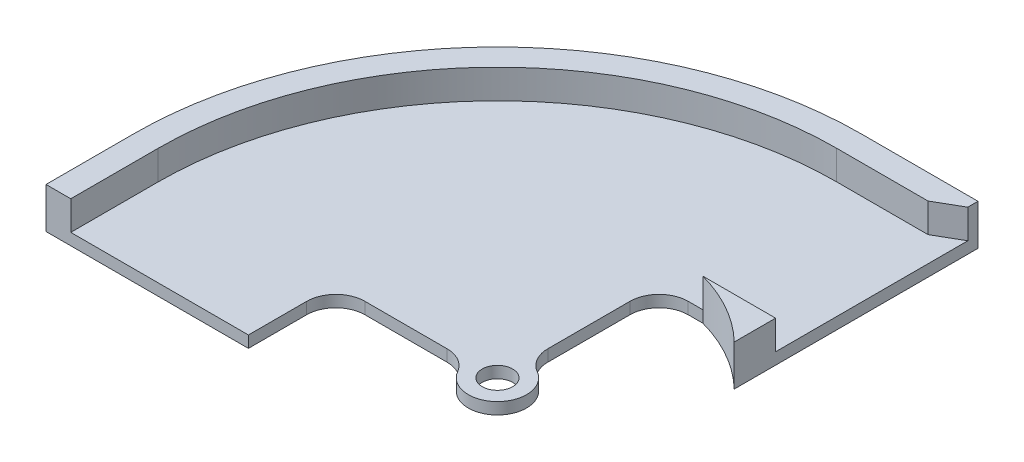
ISO-10303-21;
HEADER;
FILE_DESCRIPTION(('STEP AP214'),'2;1');
FILE_NAME('part.step','',(''),(''),'','','');
FILE_SCHEMA(('AUTOMOTIVE_DESIGN { 1 0 10303 214 1 1 1 1 }'));
ENDSEC;
DATA;
#1=APPLICATION_CONTEXT('core data for automotive mechanical design processes');
#2=APPLICATION_PROTOCOL_DEFINITION('international standard','automotive_design',2000,#1);
#3=PRODUCT_CONTEXT('',#1,'mechanical');
#4=PRODUCT('Part','Part','',(#3));
#5=PRODUCT_RELATED_PRODUCT_CATEGORY('part','',(#4));
#6=PRODUCT_DEFINITION_FORMATION('','',#4);
#7=PRODUCT_DEFINITION_CONTEXT('part definition',#1,'design');
#8=PRODUCT_DEFINITION('design','',#6,#7);
#9=PRODUCT_DEFINITION_SHAPE('','',#8);
#10=(LENGTH_UNIT() NAMED_UNIT(*) SI_UNIT(.MILLI.,.METRE.));
#11=(NAMED_UNIT(*) PLANE_ANGLE_UNIT() SI_UNIT($,.RADIAN.));
#12=(NAMED_UNIT(*) SI_UNIT($,.STERADIAN.) SOLID_ANGLE_UNIT());
#13=UNCERTAINTY_MEASURE_WITH_UNIT(LENGTH_MEASURE(1.E-05),#10,'distance_accuracy_value','');
#14=(GEOMETRIC_REPRESENTATION_CONTEXT(3) GLOBAL_UNCERTAINTY_ASSIGNED_CONTEXT((#13)) GLOBAL_UNIT_ASSIGNED_CONTEXT((#10,
#11,#12)) REPRESENTATION_CONTEXT('',''));
#15=CARTESIAN_POINT('',(0.,0.,0.));
#16=DIRECTION('',(0.,0.,1.));
#17=DIRECTION('',(1.,0.,0.));
#18=AXIS2_PLACEMENT_3D('',#15,#16,#17);
#19=CARTESIAN_POINT('',(62.5,84.1888396224811,6.99999999999996));
#20=DIRECTION('',(0.,0.,-1.));
#21=DIRECTION('',(-1.,0.,0.));
#22=AXIS2_PLACEMENT_3D('',#19,#20,#21);
#23=PLANE('',#22);
#24=DIRECTION('',(1.,0.,0.));
#25=VECTOR('',#24,1.);
#26=CARTESIAN_POINT('',(62.5,4.,6.99999999999996));
#27=LINE('',#26,#25);
#28=CARTESIAN_POINT('',(72.5,4.,6.99999999999996));
#29=VERTEX_POINT('',#28);
#30=CARTESIAN_POINT('',(77.533296378373,4.,6.99999999999997));
#31=VERTEX_POINT('',#30);
#32=EDGE_CURVE('E331',#29,#31,#27,.T.);
#33=ORIENTED_EDGE('',*,*,#32,.F.);
#34=DIRECTION('',(0.,-1.,0.));
#35=VECTOR('',#34,1.);
#36=CARTESIAN_POINT('',(72.5,0.,6.99999999999996));
#37=LINE('',#36,#35);
#38=CARTESIAN_POINT('',(72.5,0.,6.99999999999996));
#39=VERTEX_POINT('',#38);
#40=EDGE_CURVE('E198',#29,#39,#37,.T.);
#41=ORIENTED_EDGE('',*,*,#40,.T.);
#42=DIRECTION('',(1.,0.,0.));
#43=VECTOR('',#42,1.);
#44=CARTESIAN_POINT('',(62.5,0.,6.99999999999996));
#45=LINE('',#44,#43);
#46=CARTESIAN_POINT('',(77.533296378373,0.,6.99999999999997));
#47=VERTEX_POINT('',#46);
#48=EDGE_CURVE('E193',#39,#47,#45,.T.);
#49=ORIENTED_EDGE('',*,*,#48,.T.);
#50=DIRECTION('',(0.,-1.,0.));
#51=VECTOR('',#50,1.);
#52=CARTESIAN_POINT('',(77.533296378373,42.7190495858495,6.99999999999997));
#53=LINE('',#52,#51);
#54=EDGE_CURVE('E196',#31,#47,#53,.T.);
#55=ORIENTED_EDGE('',*,*,#54,.F.);
#56=EDGE_LOOP('',(#33,#41,#49,#55));
#57=FACE_BOUND('',#56,.T.);
#58=ADVANCED_FACE('F45',(#57),#23,.F.);
#59=CARTESIAN_POINT('',(62.5,4.,-62.5));
#60=DIRECTION('',(-1.,0.,0.));
#61=DIRECTION('',(0.,0.,1.));
#62=AXIS2_PLACEMENT_3D('',#59,#60,#61);
#63=PLANE('',#62);
#64=DIRECTION('',(0.,0.,-1.));
#65=VECTOR('',#64,1.);
#66=CARTESIAN_POINT('',(62.5,0.,-62.5));
#67=LINE('',#66,#65);
#68=CARTESIAN_POINT('',(62.5,0.,45.1794919243113));
#69=VERTEX_POINT('',#68);
#70=CARTESIAN_POINT('',(62.5,0.,17.));
#71=VERTEX_POINT('',#70);
#72=EDGE_CURVE('E330',#69,#71,#67,.T.);
#73=ORIENTED_EDGE('',*,*,#72,.T.);
#74=DIRECTION('',(0.,-1.,0.));
#75=VECTOR('',#74,1.);
#76=CARTESIAN_POINT('',(62.5,4.,17.));
#77=LINE('',#76,#75);
#78=CARTESIAN_POINT('',(62.5,4.,17.));
#79=VERTEX_POINT('',#78);
#80=EDGE_CURVE('E391',#71,#79,#77,.F.);
#81=ORIENTED_EDGE('',*,*,#80,.T.);
#82=DIRECTION('',(0.,0.,-1.));
#83=VECTOR('',#82,1.);
#84=CARTESIAN_POINT('',(62.5,4.,-62.5));
#85=LINE('',#84,#83);
#86=CARTESIAN_POINT('',(62.5,4.,45.1794919243113));
#87=VERTEX_POINT('',#86);
#88=EDGE_CURVE('E337',#87,#79,#85,.T.);
#89=ORIENTED_EDGE('',*,*,#88,.F.);
#90=DIRECTION('',(0.,1.,0.));
#91=VECTOR('',#90,1.);
#92=CARTESIAN_POINT('',(62.5,4.,45.1794919243113));
#93=LINE('',#92,#91);
#94=EDGE_CURVE('E387',#87,#69,#93,.F.);
#95=ORIENTED_EDGE('',*,*,#94,.T.);
#96=EDGE_LOOP('',(#73,#81,#89,#95));
#97=FACE_BOUND('',#96,.T.);
#98=ADVANCED_FACE('F495',(#97),#63,.F.);
#99=CARTESIAN_POINT('',(-62.5,4.,-62.5));
#100=DIRECTION('',(0.,0.,1.));
#101=DIRECTION('',(1.,0.,0.));
#102=AXIS2_PLACEMENT_3D('',#99,#100,#101);
#103=PLANE('',#102);
#104=DIRECTION('',(-1.,0.,0.));
#105=VECTOR('',#104,1.);
#106=CARTESIAN_POINT('',(-62.5,0.,-62.5));
#107=LINE('',#106,#105);
#108=CARTESIAN_POINT('',(102.5,0.,-62.5));
#109=VERTEX_POINT('',#108);
#110=CARTESIAN_POINT('',(62.5,0.,-62.5));
#111=VERTEX_POINT('',#110);
#112=EDGE_CURVE('E350',#109,#111,#107,.T.);
#113=ORIENTED_EDGE('',*,*,#112,.T.);
#114=DIRECTION('',(0.,-1.,0.));
#115=VECTOR('',#114,1.);
#116=CARTESIAN_POINT('',(62.5,4.,-62.5));
#117=LINE('',#116,#115);
#118=CARTESIAN_POINT('',(62.5,14.,-62.5));
#119=VERTEX_POINT('',#118);
#120=EDGE_CURVE('E366',#111,#119,#117,.F.);
#121=ORIENTED_EDGE('',*,*,#120,.T.);
#122=DIRECTION('',(-1.,0.,0.));
#123=VECTOR('',#122,1.);
#124=CARTESIAN_POINT('',(-62.5,14.,-62.5));
#125=LINE('',#124,#123);
#126=CARTESIAN_POINT('',(102.5,14.,-62.5));
#127=VERTEX_POINT('',#126);
#128=EDGE_CURVE('E276',#127,#119,#125,.T.);
#129=ORIENTED_EDGE('',*,*,#128,.F.);
#130=DIRECTION('',(0.,-1.,0.));
#131=VECTOR('',#130,1.);
#132=CARTESIAN_POINT('',(102.5,84.1888396224811,-62.5));
#133=LINE('',#132,#131);
#134=EDGE_CURVE('E325',#127,#109,#133,.T.);
#135=ORIENTED_EDGE('',*,*,#134,.T.);
#136=EDGE_LOOP('',(#113,#121,#129,#135));
#137=FACE_BOUND('',#136,.T.);
#138=ADVANCED_FACE('F480',(#137),#103,.F.);
#139=CARTESIAN_POINT('',(-62.5,4.,-62.5));
#140=DIRECTION('',(1.,0.,0.));
#141=DIRECTION('',(0.,0.,-1.));
#142=AXIS2_PLACEMENT_3D('',#139,#140,#141);
#143=PLANE('',#142);
#144=DIRECTION('',(0.,0.,1.));
#145=VECTOR('',#144,1.);
#146=CARTESIAN_POINT('',(-62.5,14.,92.5));
#147=LINE('',#146,#145);
#148=CARTESIAN_POINT('',(-62.5,14.,62.5));
#149=VERTEX_POINT('',#148);
#150=CARTESIAN_POINT('',(-62.5,14.,92.5));
#151=VERTEX_POINT('',#150);
#152=EDGE_CURVE('E280',#149,#151,#147,.T.);
#153=ORIENTED_EDGE('',*,*,#152,.F.);
#154=DIRECTION('',(0.,-1.,0.));
#155=VECTOR('',#154,1.);
#156=CARTESIAN_POINT('',(-62.5,4.,62.5));
#157=LINE('',#156,#155);
#158=CARTESIAN_POINT('',(-62.5,0.,62.5));
#159=VERTEX_POINT('',#158);
#160=EDGE_CURVE('E346',#149,#159,#157,.T.);
#161=ORIENTED_EDGE('',*,*,#160,.T.);
#162=DIRECTION('',(0.,0.,1.));
#163=VECTOR('',#162,1.);
#164=CARTESIAN_POINT('',(-62.5,0.,-62.5));
#165=LINE('',#164,#163);
#166=CARTESIAN_POINT('',(-62.5,0.,92.5));
#167=VERTEX_POINT('',#166);
#168=EDGE_CURVE('E354',#159,#167,#165,.T.);
#169=ORIENTED_EDGE('',*,*,#168,.T.);
#170=DIRECTION('',(0.,-1.,0.));
#171=VECTOR('',#170,1.);
#172=CARTESIAN_POINT('',(-62.5,79.6984147786464,92.5));
#173=LINE('',#172,#171);
#174=EDGE_CURVE('E305',#151,#167,#173,.T.);
#175=ORIENTED_EDGE('',*,*,#174,.F.);
#176=EDGE_LOOP('',(#153,#161,#169,#175));
#177=FACE_BOUND('',#176,.T.);
#178=ADVANCED_FACE('F472',(#177),#143,.F.);
#179=CARTESIAN_POINT('',(-62.5,4.,62.5));
#180=DIRECTION('',(0.,0.,-1.));
#181=DIRECTION('',(-1.,0.,0.));
#182=AXIS2_PLACEMENT_3D('',#179,#180,#181);
#183=PLANE('',#182);
#184=DIRECTION('',(1.,0.,0.));
#185=VECTOR('',#184,1.);
#186=CARTESIAN_POINT('',(-62.5,0.,62.5));
#187=LINE('',#186,#185);
#188=CARTESIAN_POINT('',(16.9999999999999,0.,62.5));
#189=VERTEX_POINT('',#188);
#190=CARTESIAN_POINT('',(45.1794919243112,0.,62.5));
#191=VERTEX_POINT('',#190);
#192=EDGE_CURVE('E342',#189,#191,#187,.T.);
#193=ORIENTED_EDGE('',*,*,#192,.T.);
#194=DIRECTION('',(0.,1.,0.));
#195=VECTOR('',#194,1.);
#196=CARTESIAN_POINT('',(45.1794919243112,4.,62.5));
#197=LINE('',#196,#195);
#198=CARTESIAN_POINT('',(45.1794919243112,4.,62.5));
#199=VERTEX_POINT('',#198);
#200=EDGE_CURVE('E404',#191,#199,#197,.T.);
#201=ORIENTED_EDGE('',*,*,#200,.T.);
#202=DIRECTION('',(1.,0.,0.));
#203=VECTOR('',#202,1.);
#204=CARTESIAN_POINT('',(-62.5,4.,62.5));
#205=LINE('',#204,#203);
#206=CARTESIAN_POINT('',(16.9999999999999,4.,62.5));
#207=VERTEX_POINT('',#206);
#208=EDGE_CURVE('E341',#207,#199,#205,.T.);
#209=ORIENTED_EDGE('',*,*,#208,.F.);
#210=DIRECTION('',(0.,-1.,0.));
#211=VECTOR('',#210,1.);
#212=CARTESIAN_POINT('',(16.9999999999999,0.,62.5));
#213=LINE('',#212,#211);
#214=EDGE_CURVE('E400',#207,#189,#213,.T.);
#215=ORIENTED_EDGE('',*,*,#214,.T.);
#216=EDGE_LOOP('',(#193,#201,#209,#215));
#217=FACE_BOUND('',#216,.T.);
#218=ADVANCED_FACE('F507',(#217),#183,.F.);
#219=CARTESIAN_POINT('',(0.,4.,0.));
#220=DIRECTION('',(0.,1.,0.));
#221=DIRECTION('',(0.,0.,1.));
#222=AXIS2_PLACEMENT_3D('',#219,#220,#221);
#223=PLANE('',#222);
#224=CARTESIAN_POINT('',(62.5,4.,62.5));
#225=DIRECTION('',(0.,1.,0.));
#226=DIRECTION('',(0.,0.,1.));
#227=AXIS2_PLACEMENT_3D('',#224,#225,#226);
#228=CIRCLE('',#227,5.25);
#229=CARTESIAN_POINT('',(62.5,4.,67.75));
#230=VERTEX_POINT('',#229);
#231=EDGE_CURVE('E241',#230,#230,#228,.T.);
#232=ORIENTED_EDGE('',*,*,#231,.F.);
#233=EDGE_LOOP('',(#232));
#234=FACE_BOUND('',#233,.T.);
#235=ORIENTED_EDGE('',*,*,#208,.T.);
#236=CARTESIAN_POINT('',(45.1794919243113,4.,72.5));
#237=DIRECTION('',(0.,1.,0.));
#238=DIRECTION('',(0.,0.,1.));
#239=AXIS2_PLACEMENT_3D('',#236,#237,#238);
#240=CIRCLE('',#239,10.);
#241=CARTESIAN_POINT('',(53.8397459621556,4.,67.5));
#242=VERTEX_POINT('',#241);
#243=EDGE_CURVE('E422',#199,#242,#240,.F.);
#244=ORIENTED_EDGE('',*,*,#243,.T.);
#245=CARTESIAN_POINT('',(62.5,4.,62.5));
#246=DIRECTION('',(0.,1.,0.));
#247=DIRECTION('',(0.,0.,1.));
#248=AXIS2_PLACEMENT_3D('',#245,#246,#247);
#249=CIRCLE('',#248,9.99999999999998);
#250=CARTESIAN_POINT('',(67.5,4.,53.8397459621556));
#251=VERTEX_POINT('',#250);
#252=EDGE_CURVE('E249',#242,#251,#249,.T.);
#253=ORIENTED_EDGE('',*,*,#252,.T.);
#254=CARTESIAN_POINT('',(72.5,4.,45.1794919243113));
#255=DIRECTION('',(0.,1.,0.));
#256=DIRECTION('',(0.,0.,1.));
#257=AXIS2_PLACEMENT_3D('',#254,#255,#256);
#258=CIRCLE('',#257,10.);
#259=EDGE_CURVE('E419',#251,#87,#258,.F.);
#260=ORIENTED_EDGE('',*,*,#259,.T.);
#261=ORIENTED_EDGE('',*,*,#88,.T.);
#262=CARTESIAN_POINT('',(72.5,4.,17.));
#263=DIRECTION('',(0.,1.,0.));
#264=DIRECTION('',(0.,0.,1.));
#265=AXIS2_PLACEMENT_3D('',#262,#263,#264);
#266=CIRCLE('',#265,10.);
#267=EDGE_CURVE('E413',#79,#29,#266,.F.);
#268=ORIENTED_EDGE('',*,*,#267,.T.);
#269=ORIENTED_EDGE('',*,*,#32,.T.);
#270=DIRECTION('',(1.,0.,0.));
#271=VECTOR('',#270,1.);
#272=CARTESIAN_POINT('',(0.,4.,6.99999999999996));
#273=LINE('',#272,#271);
#274=CARTESIAN_POINT('',(102.5,4.,6.99999999999996));
#275=VERTEX_POINT('',#274);
#276=EDGE_CURVE('E237',#31,#275,#273,.T.);
#277=ORIENTED_EDGE('',*,*,#276,.T.);
#278=DIRECTION('',(0.,0.,-1.));
#279=VECTOR('',#278,1.);
#280=CARTESIAN_POINT('',(102.5,4.,6.99999999999996));
#281=LINE('',#280,#279);
#282=CARTESIAN_POINT('',(102.5,4.,-59.));
#283=VERTEX_POINT('',#282);
#284=EDGE_CURVE('E327',#275,#283,#281,.T.);
#285=ORIENTED_EDGE('',*,*,#284,.T.);
#286=DIRECTION('',(0.866025403784439,0.,-0.5));
#287=VECTOR('',#286,1.);
#288=CARTESIAN_POINT('',(102.5,4.,-59.));
#289=LINE('',#288,#287);
#290=CARTESIAN_POINT('',(93.8397459621556,4.,-54.));
#291=VERTEX_POINT('',#290);
#292=EDGE_CURVE('E382',#283,#291,#289,.F.);
#293=ORIENTED_EDGE('',*,*,#292,.T.);
#294=DIRECTION('',(1.,0.,0.));
#295=VECTOR('',#294,1.);
#296=CARTESIAN_POINT('',(62.5,4.,-54.));
#297=LINE('',#296,#295);
#298=CARTESIAN_POINT('',(62.5,4.,-54.));
#299=VERTEX_POINT('',#298);
#300=EDGE_CURVE('E263',#299,#291,#297,.T.);
#301=ORIENTED_EDGE('',*,*,#300,.F.);
#302=CARTESIAN_POINT('',(62.5,4.,62.5));
#303=DIRECTION('',(0.,-1.,0.));
#304=DIRECTION('',(0.,0.,-1.));
#305=AXIS2_PLACEMENT_3D('',#302,#303,#304);
#306=CIRCLE('',#305,116.5);
#307=CARTESIAN_POINT('',(-54.,4.,62.5));
#308=VERTEX_POINT('',#307);
#309=EDGE_CURVE('E287',#308,#299,#306,.T.);
#310=ORIENTED_EDGE('',*,*,#309,.F.);
#311=DIRECTION('',(0.,0.,-1.));
#312=VECTOR('',#311,1.);
#313=CARTESIAN_POINT('',(-54.,4.,92.5));
#314=LINE('',#313,#312);
#315=CARTESIAN_POINT('',(-54.,4.,92.5));
#316=VERTEX_POINT('',#315);
#317=EDGE_CURVE('E257',#316,#308,#314,.T.);
#318=ORIENTED_EDGE('',*,*,#317,.F.);
#319=DIRECTION('',(1.,0.,0.));
#320=VECTOR('',#319,1.);
#321=CARTESIAN_POINT('',(-62.5,4.,92.5));
#322=LINE('',#321,#320);
#323=CARTESIAN_POINT('',(6.99999999999994,4.,92.5));
#324=VERTEX_POINT('',#323);
#325=EDGE_CURVE('E309',#316,#324,#322,.T.);
#326=ORIENTED_EDGE('',*,*,#325,.T.);
#327=DIRECTION('',(0.,0.,-1.));
#328=VECTOR('',#327,1.);
#329=CARTESIAN_POINT('',(6.99999999999994,4.,62.5));
#330=LINE('',#329,#328);
#331=CARTESIAN_POINT('',(6.99999999999994,4.,72.5));
#332=VERTEX_POINT('',#331);
#333=EDGE_CURVE('E202',#324,#332,#330,.T.);
#334=ORIENTED_EDGE('',*,*,#333,.T.);
#335=CARTESIAN_POINT('',(16.9999999999999,4.,72.5));
#336=DIRECTION('',(0.,1.,0.));
#337=DIRECTION('',(0.,0.,1.));
#338=AXIS2_PLACEMENT_3D('',#335,#336,#337);
#339=CIRCLE('',#338,10.);
#340=EDGE_CURVE('E11',#332,#207,#339,.F.);
#341=ORIENTED_EDGE('',*,*,#340,.T.);
#342=EDGE_LOOP('',(#235,#244,#253,#260,#261,#268,#269,#277,#285,#293,#301,#310,#318,#326,#334,#341));
#343=FACE_BOUND('',#342,.T.);
#344=ADVANCED_FACE('F439',(#234,#343),#223,.T.);
#345=CARTESIAN_POINT('',(0.,0.,0.));
#346=DIRECTION('',(0.,1.,0.));
#347=DIRECTION('',(0.,0.,1.));
#348=AXIS2_PLACEMENT_3D('',#345,#346,#347);
#349=PLANE('',#348);
#350=CARTESIAN_POINT('',(62.5,0.,62.5));
#351=DIRECTION('',(0.,1.,0.));
#352=DIRECTION('',(0.,0.,1.));
#353=AXIS2_PLACEMENT_3D('',#350,#351,#352);
#354=CIRCLE('',#353,5.25);
#355=CARTESIAN_POINT('',(62.5,0.,67.75));
#356=VERTEX_POINT('',#355);
#357=EDGE_CURVE('E245',#356,#356,#354,.F.);
#358=ORIENTED_EDGE('',*,*,#357,.F.);
#359=EDGE_LOOP('',(#358));
#360=FACE_BOUND('',#359,.T.);
#361=ORIENTED_EDGE('',*,*,#168,.F.);
#362=CARTESIAN_POINT('',(62.5,0.,62.5));
#363=DIRECTION('',(0.,1.,0.));
#364=DIRECTION('',(0.,0.,1.));
#365=AXIS2_PLACEMENT_3D('',#362,#363,#364);
#366=CIRCLE('',#365,125.);
#367=EDGE_CURVE('E363',#159,#111,#366,.F.);
#368=ORIENTED_EDGE('',*,*,#367,.T.);
#369=ORIENTED_EDGE('',*,*,#112,.F.);
#370=DIRECTION('',(0.,0.,-1.));
#371=VECTOR('',#370,1.);
#372=CARTESIAN_POINT('',(102.5,0.,6.99999999999996));
#373=LINE('',#372,#371);
#374=CARTESIAN_POINT('',(102.5,0.,21.1932208953542));
#375=VERTEX_POINT('',#374);
#376=EDGE_CURVE('E201',#375,#109,#373,.T.);
#377=ORIENTED_EDGE('',*,*,#376,.F.);
#378=CARTESIAN_POINT('',(62.5,0.,62.5));
#379=DIRECTION('',(0.,-1.,0.));
#380=DIRECTION('',(0.,0.,-1.));
#381=AXIS2_PLACEMENT_3D('',#378,#379,#380);
#382=CIRCLE('',#381,57.5);
#383=EDGE_CURVE('E209',#47,#375,#382,.T.);
#384=ORIENTED_EDGE('',*,*,#383,.F.);
#385=ORIENTED_EDGE('',*,*,#48,.F.);
#386=CARTESIAN_POINT('',(72.5,0.,17.));
#387=DIRECTION('',(0.,1.,0.));
#388=DIRECTION('',(0.,0.,1.));
#389=AXIS2_PLACEMENT_3D('',#386,#387,#388);
#390=CIRCLE('',#389,10.);
#391=EDGE_CURVE('E410',#39,#71,#390,.T.);
#392=ORIENTED_EDGE('',*,*,#391,.T.);
#393=ORIENTED_EDGE('',*,*,#72,.F.);
#394=CARTESIAN_POINT('',(72.5,0.,45.1794919243113));
#395=DIRECTION('',(0.,1.,0.));
#396=DIRECTION('',(0.,0.,1.));
#397=AXIS2_PLACEMENT_3D('',#394,#395,#396);
#398=CIRCLE('',#397,10.);
#399=CARTESIAN_POINT('',(67.5,0.,53.8397459621556));
#400=VERTEX_POINT('',#399);
#401=EDGE_CURVE('E416',#69,#400,#398,.T.);
#402=ORIENTED_EDGE('',*,*,#401,.T.);
#403=CARTESIAN_POINT('',(62.5,0.,62.5));
#404=DIRECTION('',(0.,1.,0.));
#405=DIRECTION('',(0.,0.,1.));
#406=AXIS2_PLACEMENT_3D('',#403,#404,#405);
#407=CIRCLE('',#406,9.99999999999998);
#408=CARTESIAN_POINT('',(53.8397459621556,0.,67.5));
#409=VERTEX_POINT('',#408);
#410=EDGE_CURVE('E253',#400,#409,#407,.F.);
#411=ORIENTED_EDGE('',*,*,#410,.T.);
#412=CARTESIAN_POINT('',(45.1794919243113,0.,72.5));
#413=DIRECTION('',(0.,1.,0.));
#414=DIRECTION('',(0.,0.,1.));
#415=AXIS2_PLACEMENT_3D('',#412,#413,#414);
#416=CIRCLE('',#415,10.);
#417=EDGE_CURVE('E425',#409,#191,#416,.T.);
#418=ORIENTED_EDGE('',*,*,#417,.T.);
#419=ORIENTED_EDGE('',*,*,#192,.F.);
#420=CARTESIAN_POINT('',(16.9999999999999,0.,72.5));
#421=DIRECTION('',(0.,1.,0.));
#422=DIRECTION('',(0.,0.,1.));
#423=AXIS2_PLACEMENT_3D('',#420,#421,#422);
#424=CIRCLE('',#423,10.);
#425=CARTESIAN_POINT('',(6.99999999999994,0.,72.5));
#426=VERTEX_POINT('',#425);
#427=EDGE_CURVE('E54',#189,#426,#424,.T.);
#428=ORIENTED_EDGE('',*,*,#427,.T.);
#429=DIRECTION('',(0.,0.,-1.));
#430=VECTOR('',#429,1.);
#431=CARTESIAN_POINT('',(6.99999999999994,0.,62.5));
#432=LINE('',#431,#430);
#433=CARTESIAN_POINT('',(6.99999999999994,0.,92.5));
#434=VERTEX_POINT('',#433);
#435=EDGE_CURVE('E306',#434,#426,#432,.T.);
#436=ORIENTED_EDGE('',*,*,#435,.F.);
#437=DIRECTION('',(1.,0.,0.));
#438=VECTOR('',#437,1.);
#439=CARTESIAN_POINT('',(-62.5,0.,92.5));
#440=LINE('',#439,#438);
#441=EDGE_CURVE('E311',#167,#434,#440,.T.);
#442=ORIENTED_EDGE('',*,*,#441,.F.);
#443=EDGE_LOOP('',(#361,#368,#369,#377,#384,#385,#392,#393,#402,#411,#418,#419,#428,#436,#442));
#444=FACE_BOUND('',#443,.T.);
#445=ADVANCED_FACE('F217',(#360,#444),#349,.F.);
#446=CARTESIAN_POINT('',(102.5,84.1888396224811,6.99999999999996));
#447=DIRECTION('',(-1.,0.,0.));
#448=DIRECTION('',(0.,0.,1.));
#449=AXIS2_PLACEMENT_3D('',#446,#447,#448);
#450=PLANE('',#449);
#451=DIRECTION('',(0.,0.,-1.));
#452=VECTOR('',#451,1.);
#453=CARTESIAN_POINT('',(102.5,14.,-54.));
#454=LINE('',#453,#452);
#455=CARTESIAN_POINT('',(102.5,14.,-59.));
#456=VERTEX_POINT('',#455);
#457=EDGE_CURVE('E273',#456,#127,#454,.T.);
#458=ORIENTED_EDGE('',*,*,#457,.F.);
#459=DIRECTION('',(0.,-1.,0.));
#460=VECTOR('',#459,1.);
#461=CARTESIAN_POINT('',(102.5,84.1888396224811,-59.));
#462=LINE('',#461,#460);
#463=EDGE_CURVE('E372',#456,#283,#462,.T.);
#464=ORIENTED_EDGE('',*,*,#463,.T.);
#465=ORIENTED_EDGE('',*,*,#284,.F.);
#466=DIRECTION('',(0.,-1.,0.));
#467=VECTOR('',#466,1.);
#468=CARTESIAN_POINT('',(102.5,42.7190495858495,6.99999999999996));
#469=LINE('',#468,#467);
#470=CARTESIAN_POINT('',(102.5,14.,6.99999999999996));
#471=VERTEX_POINT('',#470);
#472=EDGE_CURVE('E221',#471,#275,#469,.T.);
#473=ORIENTED_EDGE('',*,*,#472,.F.);
#474=DIRECTION('',(0.,0.,1.));
#475=VECTOR('',#474,1.);
#476=CARTESIAN_POINT('',(102.5,14.,6.99999999999996));
#477=LINE('',#476,#475);
#478=CARTESIAN_POINT('',(102.5,14.,21.1932208953542));
#479=VERTEX_POINT('',#478);
#480=EDGE_CURVE('E232',#471,#479,#477,.T.);
#481=ORIENTED_EDGE('',*,*,#480,.T.);
#482=DIRECTION('',(0.,-1.,0.));
#483=VECTOR('',#482,1.);
#484=CARTESIAN_POINT('',(102.5,42.7190495858495,21.1932208953542));
#485=LINE('',#484,#483);
#486=EDGE_CURVE('E214',#479,#375,#485,.T.);
#487=ORIENTED_EDGE('',*,*,#486,.T.);
#488=ORIENTED_EDGE('',*,*,#376,.T.);
#489=ORIENTED_EDGE('',*,*,#134,.F.);
#490=EDGE_LOOP('',(#458,#464,#465,#473,#481,#487,#488,#489));
#491=FACE_BOUND('',#490,.T.);
#492=ADVANCED_FACE('F443',(#491),#450,.F.);
#493=CARTESIAN_POINT('',(-62.5,79.6984147786464,92.5));
#494=DIRECTION('',(0.,0.,-1.));
#495=DIRECTION('',(-1.,0.,0.));
#496=AXIS2_PLACEMENT_3D('',#493,#494,#495);
#497=PLANE('',#496);
#498=ORIENTED_EDGE('',*,*,#325,.F.);
#499=DIRECTION('',(0.,-1.,0.));
#500=VECTOR('',#499,1.);
#501=CARTESIAN_POINT('',(-54.,14.,92.5));
#502=LINE('',#501,#500);
#503=CARTESIAN_POINT('',(-54.,14.,92.5));
#504=VERTEX_POINT('',#503);
#505=EDGE_CURVE('E301',#504,#316,#502,.T.);
#506=ORIENTED_EDGE('',*,*,#505,.F.);
#507=DIRECTION('',(1.,0.,0.));
#508=VECTOR('',#507,1.);
#509=CARTESIAN_POINT('',(-62.5,14.,92.5));
#510=LINE('',#509,#508);
#511=EDGE_CURVE('E258',#151,#504,#510,.T.);
#512=ORIENTED_EDGE('',*,*,#511,.F.);
#513=ORIENTED_EDGE('',*,*,#174,.T.);
#514=ORIENTED_EDGE('',*,*,#441,.T.);
#515=DIRECTION('',(0.,-1.,0.));
#516=VECTOR('',#515,1.);
#517=CARTESIAN_POINT('',(6.99999999999994,79.6984147786464,92.5));
#518=LINE('',#517,#516);
#519=EDGE_CURVE('E310',#324,#434,#518,.T.);
#520=ORIENTED_EDGE('',*,*,#519,.F.);
#521=EDGE_LOOP('',(#498,#506,#512,#513,#514,#520));
#522=FACE_BOUND('',#521,.T.);
#523=ADVANCED_FACE('F464',(#522),#497,.F.);
#524=CARTESIAN_POINT('',(6.99999999999994,79.6984147786464,62.5));
#525=DIRECTION('',(-1.,0.,0.));
#526=DIRECTION('',(0.,0.,1.));
#527=AXIS2_PLACEMENT_3D('',#524,#525,#526);
#528=PLANE('',#527);
#529=ORIENTED_EDGE('',*,*,#435,.T.);
#530=DIRECTION('',(0.,-1.,0.));
#531=VECTOR('',#530,1.);
#532=CARTESIAN_POINT('',(6.99999999999994,4.,72.5));
#533=LINE('',#532,#531);
#534=EDGE_CURVE('E67',#426,#332,#533,.F.);
#535=ORIENTED_EDGE('',*,*,#534,.T.);
#536=ORIENTED_EDGE('',*,*,#333,.F.);
#537=ORIENTED_EDGE('',*,*,#519,.T.);
#538=EDGE_LOOP('',(#529,#535,#536,#537));
#539=FACE_BOUND('',#538,.T.);
#540=ADVANCED_FACE('F467',(#539),#528,.F.);
#541=CARTESIAN_POINT('',(-54.,14.,92.5));
#542=DIRECTION('',(-1.,0.,0.));
#543=DIRECTION('',(0.,0.,1.));
#544=AXIS2_PLACEMENT_3D('',#541,#542,#543);
#545=PLANE('',#544);
#546=ORIENTED_EDGE('',*,*,#317,.T.);
#547=DIRECTION('',(0.,-1.,0.));
#548=VECTOR('',#547,1.);
#549=CARTESIAN_POINT('',(-54.,14.,62.5));
#550=LINE('',#549,#548);
#551=CARTESIAN_POINT('',(-54.,14.,62.5));
#552=VERTEX_POINT('',#551);
#553=EDGE_CURVE('E297',#552,#308,#550,.T.);
#554=ORIENTED_EDGE('',*,*,#553,.F.);
#555=DIRECTION('',(0.,0.,-1.));
#556=VECTOR('',#555,1.);
#557=CARTESIAN_POINT('',(-54.,14.,92.5));
#558=LINE('',#557,#556);
#559=EDGE_CURVE('E262',#504,#552,#558,.T.);
#560=ORIENTED_EDGE('',*,*,#559,.F.);
#561=ORIENTED_EDGE('',*,*,#505,.T.);
#562=EDGE_LOOP('',(#546,#554,#560,#561));
#563=FACE_BOUND('',#562,.T.);
#564=ADVANCED_FACE('F460',(#563),#545,.F.);
#565=CARTESIAN_POINT('',(62.5,14.,62.5));
#566=DIRECTION('',(0.,-1.,0.));
#567=DIRECTION('',(0.,0.,-1.));
#568=AXIS2_PLACEMENT_3D('',#565,#566,#567);
#569=CYLINDRICAL_SURFACE('',#568,116.5);
#570=ORIENTED_EDGE('',*,*,#309,.T.);
#571=DIRECTION('',(0.,-1.,0.));
#572=VECTOR('',#571,1.);
#573=CARTESIAN_POINT('',(62.5,14.,-54.));
#574=LINE('',#573,#572);
#575=CARTESIAN_POINT('',(62.5,14.,-54.));
#576=VERTEX_POINT('',#575);
#577=EDGE_CURVE('E283',#576,#299,#574,.T.);
#578=ORIENTED_EDGE('',*,*,#577,.F.);
#579=CARTESIAN_POINT('',(62.5,14.,62.5));
#580=DIRECTION('',(0.,-1.,0.));
#581=DIRECTION('',(0.,0.,-1.));
#582=AXIS2_PLACEMENT_3D('',#579,#580,#581);
#583=CIRCLE('',#582,116.5);
#584=EDGE_CURVE('E266',#552,#576,#583,.T.);
#585=ORIENTED_EDGE('',*,*,#584,.F.);
#586=ORIENTED_EDGE('',*,*,#553,.T.);
#587=EDGE_LOOP('',(#570,#578,#585,#586));
#588=FACE_BOUND('',#587,.T.);
#589=ADVANCED_FACE('F456',(#588),#569,.F.);
#590=CARTESIAN_POINT('',(62.5,14.,-54.));
#591=DIRECTION('',(0.,0.,-1.));
#592=DIRECTION('',(-1.,0.,0.));
#593=AXIS2_PLACEMENT_3D('',#590,#591,#592);
#594=PLANE('',#593);
#595=ORIENTED_EDGE('',*,*,#300,.T.);
#596=DIRECTION('',(0.,1.,0.));
#597=VECTOR('',#596,1.);
#598=CARTESIAN_POINT('',(93.8397459621556,14.,-54.));
#599=LINE('',#598,#597);
#600=CARTESIAN_POINT('',(93.8397459621556,14.,-54.));
#601=VERTEX_POINT('',#600);
#602=EDGE_CURVE('E376',#291,#601,#599,.T.);
#603=ORIENTED_EDGE('',*,*,#602,.T.);
#604=DIRECTION('',(1.,0.,0.));
#605=VECTOR('',#604,1.);
#606=CARTESIAN_POINT('',(62.5,14.,-54.));
#607=LINE('',#606,#605);
#608=EDGE_CURVE('E269',#576,#601,#607,.T.);
#609=ORIENTED_EDGE('',*,*,#608,.F.);
#610=ORIENTED_EDGE('',*,*,#577,.T.);
#611=EDGE_LOOP('',(#595,#603,#609,#610));
#612=FACE_BOUND('',#611,.T.);
#613=ADVANCED_FACE('F451',(#612),#594,.F.);
#614=CARTESIAN_POINT('',(62.5,14.,62.5));
#615=DIRECTION('',(0.,-1.,0.));
#616=DIRECTION('',(0.,0.,-1.));
#617=AXIS2_PLACEMENT_3D('',#614,#615,#616);
#618=PLANE('',#617);
#619=ORIENTED_EDGE('',*,*,#608,.T.);
#620=DIRECTION('',(-0.866025403784439,0.,0.5));
#621=VECTOR('',#620,1.);
#622=CARTESIAN_POINT('',(102.5,14.,-59.));
#623=LINE('',#622,#621);
#624=EDGE_CURVE('E379',#601,#456,#623,.F.);
#625=ORIENTED_EDGE('',*,*,#624,.T.);
#626=ORIENTED_EDGE('',*,*,#457,.T.);
#627=ORIENTED_EDGE('',*,*,#128,.T.);
#628=CARTESIAN_POINT('',(62.5,14.,62.5));
#629=DIRECTION('',(0.,-1.,0.));
#630=DIRECTION('',(0.,0.,-1.));
#631=AXIS2_PLACEMENT_3D('',#628,#629,#630);
#632=CIRCLE('',#631,125.);
#633=EDGE_CURVE('E369',#119,#149,#632,.F.);
#634=ORIENTED_EDGE('',*,*,#633,.T.);
#635=ORIENTED_EDGE('',*,*,#152,.T.);
#636=ORIENTED_EDGE('',*,*,#511,.T.);
#637=ORIENTED_EDGE('',*,*,#559,.T.);
#638=ORIENTED_EDGE('',*,*,#584,.T.);
#639=EDGE_LOOP('',(#619,#625,#626,#627,#634,#635,#636,#637,#638));
#640=FACE_BOUND('',#639,.T.);
#641=ADVANCED_FACE('F482',(#640),#618,.F.);
#642=CARTESIAN_POINT('',(62.5,-28.2842712474618,62.5));
#643=DIRECTION('',(0.,1.,0.));
#644=DIRECTION('',(0.,0.,1.));
#645=AXIS2_PLACEMENT_3D('',#642,#643,#644);
#646=CYLINDRICAL_SURFACE('',#645,9.99999999999998);
#647=ORIENTED_EDGE('',*,*,#410,.F.);
#648=DIRECTION('',(0.,1.,0.));
#649=VECTOR('',#648,1.);
#650=CARTESIAN_POINT('',(67.5,-28.2842712474618,53.8397459621556));
#651=LINE('',#650,#649);
#652=EDGE_CURVE('E397',#400,#251,#651,.T.);
#653=ORIENTED_EDGE('',*,*,#652,.T.);
#654=ORIENTED_EDGE('',*,*,#252,.F.);
#655=DIRECTION('',(0.,1.,0.));
#656=VECTOR('',#655,1.);
#657=CARTESIAN_POINT('',(53.8397459621556,-28.2842712474618,67.5));
#658=LINE('',#657,#656);
#659=EDGE_CURVE('E394',#242,#409,#658,.F.);
#660=ORIENTED_EDGE('',*,*,#659,.T.);
#661=EDGE_LOOP('',(#647,#653,#654,#660));
#662=FACE_BOUND('',#661,.T.);
#663=ADVANCED_FACE('F484',(#662),#646,.T.);
#664=CARTESIAN_POINT('',(62.5,-14.8492424049175,62.5));
#665=DIRECTION('',(0.,1.,0.));
#666=DIRECTION('',(0.,0.,1.));
#667=AXIS2_PLACEMENT_3D('',#664,#665,#666);
#668=CYLINDRICAL_SURFACE('',#667,5.25);
#669=ORIENTED_EDGE('',*,*,#357,.T.);
#670=EDGE_LOOP('',(#669));
#671=FACE_BOUND('',#670,.T.);
#672=ORIENTED_EDGE('',*,*,#231,.T.);
#673=EDGE_LOOP('',(#672));
#674=FACE_BOUND('',#673,.T.);
#675=ADVANCED_FACE('F490',(#671,#674),#668,.F.);
#676=CARTESIAN_POINT('',(62.5,4.,62.5));
#677=DIRECTION('',(0.,-1.,0.));
#678=DIRECTION('',(0.,0.,-1.));
#679=AXIS2_PLACEMENT_3D('',#676,#677,#678);
#680=CYLINDRICAL_SURFACE('',#679,125.);
#681=ORIENTED_EDGE('',*,*,#633,.F.);
#682=ORIENTED_EDGE('',*,*,#120,.F.);
#683=ORIENTED_EDGE('',*,*,#367,.F.);
#684=ORIENTED_EDGE('',*,*,#160,.F.);
#685=EDGE_LOOP('',(#681,#682,#683,#684));
#686=FACE_BOUND('',#685,.T.);
#687=ADVANCED_FACE('F476',(#686),#680,.T.);
#688=CARTESIAN_POINT('',(102.5,84.1888396224811,-59.));
#689=DIRECTION('',(-0.5,0.,-0.866025403784439));
#690=DIRECTION('',(0.,-1.,0.));
#691=AXIS2_PLACEMENT_3D('',#688,#689,#690);
#692=PLANE('',#691);
#693=ORIENTED_EDGE('',*,*,#624,.F.);
#694=ORIENTED_EDGE('',*,*,#602,.F.);
#695=ORIENTED_EDGE('',*,*,#292,.F.);
#696=ORIENTED_EDGE('',*,*,#463,.F.);
#697=EDGE_LOOP('',(#693,#694,#695,#696));
#698=FACE_BOUND('',#697,.T.);
#699=ADVANCED_FACE('F448',(#698),#692,.F.);
#700=CARTESIAN_POINT('',(62.5,42.7190495858495,62.5));
#701=DIRECTION('',(0.,-1.,0.));
#702=DIRECTION('',(0.,0.,-1.));
#703=AXIS2_PLACEMENT_3D('',#700,#701,#702);
#704=CYLINDRICAL_SURFACE('',#703,57.5);
#705=ORIENTED_EDGE('',*,*,#486,.F.);
#706=CARTESIAN_POINT('',(62.5,14.,62.5));
#707=DIRECTION('',(0.,-1.,0.));
#708=DIRECTION('',(0.,0.,-1.));
#709=AXIS2_PLACEMENT_3D('',#706,#707,#708);
#710=CIRCLE('',#709,57.5);
#711=CARTESIAN_POINT('',(77.533296378373,14.,6.99999999999997));
#712=VERTEX_POINT('',#711);
#713=EDGE_CURVE('E236',#479,#712,#710,.F.);
#714=ORIENTED_EDGE('',*,*,#713,.T.);
#715=EDGE_CURVE('E212',#712,#31,#53,.T.);
#716=ORIENTED_EDGE('',*,*,#715,.T.);
#717=ORIENTED_EDGE('',*,*,#54,.T.);
#718=ORIENTED_EDGE('',*,*,#383,.T.);
#719=EDGE_LOOP('',(#705,#714,#716,#717,#718));
#720=FACE_BOUND('',#719,.T.);
#721=ADVANCED_FACE('F208',(#720),#704,.F.);
#722=CARTESIAN_POINT('',(102.5,42.7190495858495,6.99999999999996));
#723=DIRECTION('',(0.,0.,1.));
#724=DIRECTION('',(1.,0.,0.));
#725=AXIS2_PLACEMENT_3D('',#722,#723,#724);
#726=PLANE('',#725);
#727=ORIENTED_EDGE('',*,*,#276,.F.);
#728=ORIENTED_EDGE('',*,*,#715,.F.);
#729=DIRECTION('',(1.,0.,0.));
#730=VECTOR('',#729,1.);
#731=CARTESIAN_POINT('',(102.5,14.,6.99999999999996));
#732=LINE('',#731,#730);
#733=EDGE_CURVE('E226',#712,#471,#732,.T.);
#734=ORIENTED_EDGE('',*,*,#733,.T.);
#735=ORIENTED_EDGE('',*,*,#472,.T.);
#736=EDGE_LOOP('',(#727,#728,#734,#735));
#737=FACE_BOUND('',#736,.T.);
#738=ADVANCED_FACE('F436',(#737),#726,.F.);
#739=CARTESIAN_POINT('',(62.5,14.,62.5));
#740=DIRECTION('',(0.,-1.,0.));
#741=DIRECTION('',(0.,0.,-1.));
#742=AXIS2_PLACEMENT_3D('',#739,#740,#741);
#743=PLANE('',#742);
#744=ORIENTED_EDGE('',*,*,#713,.F.);
#745=ORIENTED_EDGE('',*,*,#480,.F.);
#746=ORIENTED_EDGE('',*,*,#733,.F.);
#747=EDGE_LOOP('',(#744,#745,#746));
#748=FACE_BOUND('',#747,.T.);
#749=ADVANCED_FACE('F432',(#748),#743,.F.);
#750=CARTESIAN_POINT('',(72.5,84.1888396224811,17.));
#751=DIRECTION('',(0.,1.,0.));
#752=DIRECTION('',(0.,0.,1.));
#753=AXIS2_PLACEMENT_3D('',#750,#751,#752);
#754=CYLINDRICAL_SURFACE('',#753,10.);
#755=ORIENTED_EDGE('',*,*,#267,.F.);
#756=ORIENTED_EDGE('',*,*,#80,.F.);
#757=ORIENTED_EDGE('',*,*,#391,.F.);
#758=ORIENTED_EDGE('',*,*,#40,.F.);
#759=EDGE_LOOP('',(#755,#756,#757,#758));
#760=FACE_BOUND('',#759,.T.);
#761=ADVANCED_FACE('F526',(#760),#754,.F.);
#762=CARTESIAN_POINT('',(72.5,-28.2842712474618,45.1794919243113));
#763=DIRECTION('',(0.,1.,0.));
#764=DIRECTION('',(0.,0.,1.));
#765=AXIS2_PLACEMENT_3D('',#762,#763,#764);
#766=CYLINDRICAL_SURFACE('',#765,10.);
#767=ORIENTED_EDGE('',*,*,#259,.F.);
#768=ORIENTED_EDGE('',*,*,#652,.F.);
#769=ORIENTED_EDGE('',*,*,#401,.F.);
#770=ORIENTED_EDGE('',*,*,#94,.F.);
#771=EDGE_LOOP('',(#767,#768,#769,#770));
#772=FACE_BOUND('',#771,.T.);
#773=ADVANCED_FACE('F529',(#772),#766,.F.);
#774=CARTESIAN_POINT('',(45.1794919243113,-28.2842712474618,72.5));
#775=DIRECTION('',(0.,1.,0.));
#776=DIRECTION('',(0.,0.,1.));
#777=AXIS2_PLACEMENT_3D('',#774,#775,#776);
#778=CYLINDRICAL_SURFACE('',#777,10.);
#779=ORIENTED_EDGE('',*,*,#417,.F.);
#780=ORIENTED_EDGE('',*,*,#659,.F.);
#781=ORIENTED_EDGE('',*,*,#243,.F.);
#782=ORIENTED_EDGE('',*,*,#200,.F.);
#783=EDGE_LOOP('',(#779,#780,#781,#782));
#784=FACE_BOUND('',#783,.T.);
#785=ADVANCED_FACE('F532',(#784),#778,.F.);
#786=CARTESIAN_POINT('',(16.9999999999999,4.,72.5));
#787=DIRECTION('',(0.,1.,0.));
#788=DIRECTION('',(0.,0.,1.));
#789=AXIS2_PLACEMENT_3D('',#786,#787,#788);
#790=CYLINDRICAL_SURFACE('',#789,10.);
#791=ORIENTED_EDGE('',*,*,#340,.F.);
#792=ORIENTED_EDGE('',*,*,#534,.F.);
#793=ORIENTED_EDGE('',*,*,#427,.F.);
#794=ORIENTED_EDGE('',*,*,#214,.F.);
#795=EDGE_LOOP('',(#791,#792,#793,#794));
#796=FACE_BOUND('',#795,.T.);
#797=ADVANCED_FACE('F47',(#796),#790,.F.);
#798=CLOSED_SHELL('',(#58,#98,#138,#178,#218,#344,#445,#492,#523,#540,#564,#589,#613,#641,#663,
#675,#687,#699,#721,#738,#749,#761,#773,#785,#797));
#799=MANIFOLD_SOLID_BREP('B2',#798);
#800=ADVANCED_BREP_SHAPE_REPRESENTATION('',(#18,#799),#14);
#801=SHAPE_DEFINITION_REPRESENTATION(#9,#800);
ENDSEC;
END-ISO-10303-21;
